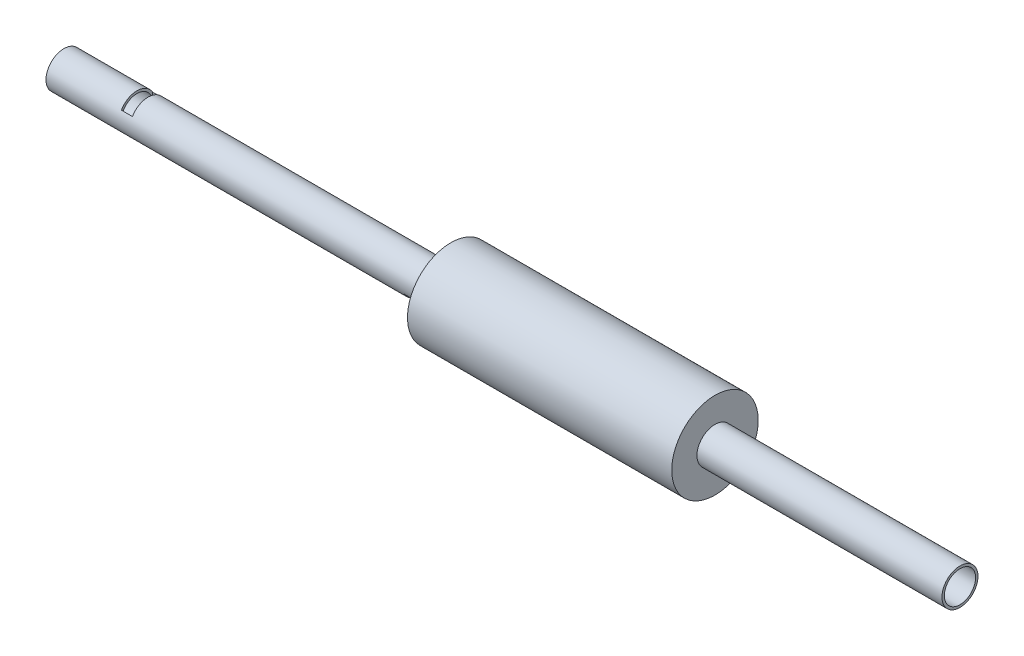
ISO-10303-21;
HEADER;
FILE_DESCRIPTION(('STEP AP214'),'2;1');
FILE_NAME('part.step','',(''),(''),'','','');
FILE_SCHEMA(('AUTOMOTIVE_DESIGN { 1 0 10303 214 1 1 1 1 }'));
ENDSEC;
DATA;
#1=APPLICATION_CONTEXT('core data for automotive mechanical design processes');
#2=APPLICATION_PROTOCOL_DEFINITION('international standard','automotive_design',2000,#1);
#3=PRODUCT_CONTEXT('',#1,'mechanical');
#4=PRODUCT('Part','Part','',(#3));
#5=PRODUCT_RELATED_PRODUCT_CATEGORY('part','',(#4));
#6=PRODUCT_DEFINITION_FORMATION('','',#4);
#7=PRODUCT_DEFINITION_CONTEXT('part definition',#1,'design');
#8=PRODUCT_DEFINITION('design','',#6,#7);
#9=PRODUCT_DEFINITION_SHAPE('','',#8);
#10=(LENGTH_UNIT() NAMED_UNIT(*) SI_UNIT(.MILLI.,.METRE.));
#11=(NAMED_UNIT(*) PLANE_ANGLE_UNIT() SI_UNIT($,.RADIAN.));
#12=(NAMED_UNIT(*) SI_UNIT($,.STERADIAN.) SOLID_ANGLE_UNIT());
#13=UNCERTAINTY_MEASURE_WITH_UNIT(LENGTH_MEASURE(1.E-05),#10,'distance_accuracy_value','');
#14=(GEOMETRIC_REPRESENTATION_CONTEXT(3) GLOBAL_UNCERTAINTY_ASSIGNED_CONTEXT((#13)) GLOBAL_UNIT_ASSIGNED_CONTEXT((#10,
#11,#12)) REPRESENTATION_CONTEXT('',''));
#15=CARTESIAN_POINT('',(0.,0.,0.));
#16=DIRECTION('',(0.,0.,1.));
#17=DIRECTION('',(1.,0.,0.));
#18=AXIS2_PLACEMENT_3D('',#15,#16,#17);
#19=CARTESIAN_POINT('',(196.356223273704,0.,0.));
#20=DIRECTION('',(1.,0.,0.));
#21=DIRECTION('',(0.,0.,-1.));
#22=AXIS2_PLACEMENT_3D('',#19,#20,#21);
#23=CYLINDRICAL_SURFACE('',#22,7.5);
#24=DIRECTION('',(1.,0.,0.));
#25=VECTOR('',#24,1.);
#26=CARTESIAN_POINT('',(196.356223273704,-3.74165738677397,6.5));
#27=LINE('',#26,#25);
#28=CARTESIAN_POINT('',(-68.,-3.74165738677397,6.5));
#29=VERTEX_POINT('',#28);
#30=CARTESIAN_POINT('',(-60.,-3.74165738677397,6.5));
#31=VERTEX_POINT('',#30);
#32=EDGE_CURVE('E149',#29,#31,#27,.T.);
#33=ORIENTED_EDGE('',*,*,#32,.T.);
#34=CARTESIAN_POINT('',(-60.,0.,0.));
#35=DIRECTION('',(1.,0.,0.));
#36=DIRECTION('',(0.,0.,-1.));
#37=AXIS2_PLACEMENT_3D('',#34,#35,#36);
#38=CIRCLE('',#37,7.5);
#39=CARTESIAN_POINT('',(-60.,-3.74165738677396,-6.5));
#40=VERTEX_POINT('',#39);
#41=EDGE_CURVE('E162',#31,#40,#38,.T.);
#42=ORIENTED_EDGE('',*,*,#41,.T.);
#43=DIRECTION('',(1.,0.,0.));
#44=VECTOR('',#43,1.);
#45=CARTESIAN_POINT('',(196.356223273704,-3.74165738677396,-6.5));
#46=LINE('',#45,#44);
#47=CARTESIAN_POINT('',(-68.,-3.74165738677396,-6.5));
#48=VERTEX_POINT('',#47);
#49=EDGE_CURVE('E144',#48,#40,#46,.T.);
#50=ORIENTED_EDGE('',*,*,#49,.F.);
#51=CARTESIAN_POINT('',(-68.,0.,0.));
#52=DIRECTION('',(1.,0.,0.));
#53=DIRECTION('',(0.,0.,-1.));
#54=AXIS2_PLACEMENT_3D('',#51,#52,#53);
#55=CIRCLE('',#54,7.5);
#56=EDGE_CURVE('E147',#29,#48,#55,.T.);
#57=ORIENTED_EDGE('',*,*,#56,.F.);
#58=EDGE_LOOP('',(#33,#42,#50,#57));
#59=FACE_BOUND('',#58,.T.);
#60=CARTESIAN_POINT('',(-216.,0.,0.));
#61=DIRECTION('',(1.,0.,0.));
#62=DIRECTION('',(0.,0.,-1.));
#63=AXIS2_PLACEMENT_3D('',#60,#61,#62);
#64=CIRCLE('',#63,7.49999999999997);
#65=CARTESIAN_POINT('',(-216.,0.,-7.49999999999997));
#66=VERTEX_POINT('',#65);
#67=EDGE_CURVE('E184',#66,#66,#64,.T.);
#68=ORIENTED_EDGE('',*,*,#67,.T.);
#69=EDGE_LOOP('',(#68));
#70=FACE_BOUND('',#69,.T.);
#71=CARTESIAN_POINT('',(-55.,0.,0.));
#72=DIRECTION('',(1.,0.,0.));
#73=DIRECTION('',(0.,0.,-1.));
#74=AXIS2_PLACEMENT_3D('',#71,#72,#73);
#75=CIRCLE('',#74,7.49999999999998);
#76=CARTESIAN_POINT('',(-55.,0.,-7.49999999999998));
#77=VERTEX_POINT('',#76);
#78=EDGE_CURVE('E187',#77,#77,#75,.T.);
#79=ORIENTED_EDGE('',*,*,#78,.F.);
#80=EDGE_LOOP('',(#79));
#81=FACE_BOUND('',#80,.T.);
#82=CARTESIAN_POINT('',(-181.,0.,0.));
#83=DIRECTION('',(-1.,0.,0.));
#84=DIRECTION('',(0.,0.,1.));
#85=AXIS2_PLACEMENT_3D('',#82,#83,#84);
#86=CIRCLE('',#85,7.5);
#87=CARTESIAN_POINT('',(-181.,3.74165738677391,6.50000000000002));
#88=VERTEX_POINT('',#87);
#89=CARTESIAN_POINT('',(-181.,3.74165738677396,-6.49999999999998));
#90=VERTEX_POINT('',#89);
#91=EDGE_CURVE('E110',#88,#90,#86,.T.);
#92=ORIENTED_EDGE('',*,*,#91,.F.);
#93=DIRECTION('',(1.,0.,0.));
#94=VECTOR('',#93,1.);
#95=CARTESIAN_POINT('',(196.356223273704,3.74165738677391,6.50000000000002));
#96=LINE('',#95,#94);
#97=CARTESIAN_POINT('',(-185.6,3.74165738677391,6.50000000000002));
#98=VERTEX_POINT('',#97);
#99=EDGE_CURVE('E130',#98,#88,#96,.T.);
#100=ORIENTED_EDGE('',*,*,#99,.F.);
#101=CARTESIAN_POINT('',(-185.6,0.,0.));
#102=DIRECTION('',(-1.,0.,0.));
#103=DIRECTION('',(0.,0.,1.));
#104=AXIS2_PLACEMENT_3D('',#101,#102,#103);
#105=CIRCLE('',#104,7.5);
#106=CARTESIAN_POINT('',(-185.6,3.74165738677396,-6.49999999999998));
#107=VERTEX_POINT('',#106);
#108=EDGE_CURVE('E136',#98,#107,#105,.T.);
#109=ORIENTED_EDGE('',*,*,#108,.T.);
#110=DIRECTION('',(1.,0.,0.));
#111=VECTOR('',#110,1.);
#112=CARTESIAN_POINT('',(196.356223273704,3.74165738677396,-6.49999999999998));
#113=LINE('',#112,#111);
#114=EDGE_CURVE('E123',#107,#90,#113,.T.);
#115=ORIENTED_EDGE('',*,*,#114,.T.);
#116=EDGE_LOOP('',(#92,#100,#109,#115));
#117=FACE_BOUND('',#116,.T.);
#118=ADVANCED_FACE('F37',(#59,#70,#81,#117),#23,.T.);
#119=CARTESIAN_POINT('',(196.356223273704,0.,0.));
#120=DIRECTION('',(1.,0.,0.));
#121=DIRECTION('',(0.,0.,-1.));
#122=AXIS2_PLACEMENT_3D('',#119,#120,#121);
#123=CYLINDRICAL_SURFACE('',#122,6.49999999999997);
#124=DIRECTION('',(1.,0.,0.));
#125=VECTOR('',#124,1.);
#126=CARTESIAN_POINT('',(0.,0.,6.5));
#127=LINE('',#126,#125);
#128=CARTESIAN_POINT('',(-68.,0.,6.49999999999998));
#129=VERTEX_POINT('',#128);
#130=CARTESIAN_POINT('',(-60.,0.,6.5));
#131=VERTEX_POINT('',#130);
#132=EDGE_CURVE('E152',#129,#131,#127,.T.);
#133=ORIENTED_EDGE('',*,*,#132,.F.);
#134=CARTESIAN_POINT('',(-68.,0.,0.));
#135=DIRECTION('',(1.,0.,0.));
#136=DIRECTION('',(0.,0.,-1.));
#137=AXIS2_PLACEMENT_3D('',#134,#135,#136);
#138=CIRCLE('',#137,6.49999999999997);
#139=CARTESIAN_POINT('',(-68.,0.,-6.49999999999997));
#140=VERTEX_POINT('',#139);
#141=EDGE_CURVE('E142',#140,#129,#138,.F.);
#142=ORIENTED_EDGE('',*,*,#141,.F.);
#143=DIRECTION('',(1.,0.,0.));
#144=VECTOR('',#143,1.);
#145=CARTESIAN_POINT('',(0.,0.,-6.5));
#146=LINE('',#145,#144);
#147=CARTESIAN_POINT('',(-60.,0.,-6.5));
#148=VERTEX_POINT('',#147);
#149=EDGE_CURVE('E155',#140,#148,#146,.T.);
#150=ORIENTED_EDGE('',*,*,#149,.T.);
#151=CARTESIAN_POINT('',(-60.,0.,0.));
#152=DIRECTION('',(1.,0.,0.));
#153=DIRECTION('',(0.,0.,-1.));
#154=AXIS2_PLACEMENT_3D('',#151,#152,#153);
#155=CIRCLE('',#154,6.49999999999997);
#156=EDGE_CURVE('E139',#148,#131,#155,.F.);
#157=ORIENTED_EDGE('',*,*,#156,.T.);
#158=EDGE_LOOP('',(#133,#142,#150,#157));
#159=FACE_BOUND('',#158,.T.);
#160=CARTESIAN_POINT('',(157.,0.,0.));
#161=DIRECTION('',(1.,0.,0.));
#162=DIRECTION('',(0.,0.,-1.));
#163=AXIS2_PLACEMENT_3D('',#160,#161,#162);
#164=CIRCLE('',#163,6.49999999999997);
#165=CARTESIAN_POINT('',(157.,0.,-6.49999999999997));
#166=VERTEX_POINT('',#165);
#167=EDGE_CURVE('E178',#166,#166,#164,.T.);
#168=ORIENTED_EDGE('',*,*,#167,.T.);
#169=EDGE_LOOP('',(#168));
#170=FACE_BOUND('',#169,.T.);
#171=CARTESIAN_POINT('',(-216.,0.,0.));
#172=DIRECTION('',(1.,0.,0.));
#173=DIRECTION('',(0.,0.,-1.));
#174=AXIS2_PLACEMENT_3D('',#171,#172,#173);
#175=CIRCLE('',#174,6.49999999999997);
#176=CARTESIAN_POINT('',(-216.,0.,-6.49999999999997));
#177=VERTEX_POINT('',#176);
#178=EDGE_CURVE('E181',#177,#177,#175,.T.);
#179=ORIENTED_EDGE('',*,*,#178,.F.);
#180=EDGE_LOOP('',(#179));
#181=FACE_BOUND('',#180,.T.);
#182=CARTESIAN_POINT('',(-185.6,0.,0.));
#183=DIRECTION('',(-1.,0.,0.));
#184=DIRECTION('',(0.,0.,1.));
#185=AXIS2_PLACEMENT_3D('',#182,#183,#184);
#186=CIRCLE('',#185,6.49999999999997);
#187=CARTESIAN_POINT('',(-185.6,0.,-6.49999999999998));
#188=VERTEX_POINT('',#187);
#189=CARTESIAN_POINT('',(-185.6,0.,6.50000000000002));
#190=VERTEX_POINT('',#189);
#191=EDGE_CURVE('E124',#188,#190,#186,.F.);
#192=ORIENTED_EDGE('',*,*,#191,.T.);
#193=DIRECTION('',(1.,0.,0.));
#194=VECTOR('',#193,1.);
#195=CARTESIAN_POINT('',(0.,0.,6.50000000000002));
#196=LINE('',#195,#194);
#197=CARTESIAN_POINT('',(-181.,0.,6.50000000000002));
#198=VERTEX_POINT('',#197);
#199=EDGE_CURVE('E60',#190,#198,#196,.T.);
#200=ORIENTED_EDGE('',*,*,#199,.T.);
#201=CARTESIAN_POINT('',(-181.,0.,0.));
#202=DIRECTION('',(-1.,0.,0.));
#203=DIRECTION('',(0.,0.,1.));
#204=AXIS2_PLACEMENT_3D('',#201,#202,#203);
#205=CIRCLE('',#204,6.49999999999997);
#206=CARTESIAN_POINT('',(-181.,0.,-6.49999999999997));
#207=VERTEX_POINT('',#206);
#208=EDGE_CURVE('E108',#207,#198,#205,.F.);
#209=ORIENTED_EDGE('',*,*,#208,.F.);
#210=DIRECTION('',(1.,0.,0.));
#211=VECTOR('',#210,1.);
#212=CARTESIAN_POINT('',(0.,0.,-6.49999999999998));
#213=LINE('',#212,#211);
#214=EDGE_CURVE('E116',#188,#207,#213,.T.);
#215=ORIENTED_EDGE('',*,*,#214,.F.);
#216=EDGE_LOOP('',(#192,#200,#209,#215));
#217=FACE_BOUND('',#216,.T.);
#218=ADVANCED_FACE('F122',(#159,#170,#181,#217),#123,.F.);
#219=CARTESIAN_POINT('',(55.,0.,0.));
#220=DIRECTION('',(-1.,0.,0.));
#221=DIRECTION('',(0.,0.,1.));
#222=AXIS2_PLACEMENT_3D('',#219,#220,#221);
#223=PLANE('',#222);
#224=CARTESIAN_POINT('',(55.,0.,0.));
#225=DIRECTION('',(1.,0.,0.));
#226=DIRECTION('',(0.,0.,-1.));
#227=AXIS2_PLACEMENT_3D('',#224,#225,#226);
#228=CIRCLE('',#227,7.5);
#229=CARTESIAN_POINT('',(55.,0.,-7.5));
#230=VERTEX_POINT('',#229);
#231=EDGE_CURVE('E172',#230,#230,#228,.T.);
#232=ORIENTED_EDGE('',*,*,#231,.F.);
#233=EDGE_LOOP('',(#232));
#234=FACE_BOUND('',#233,.T.);
#235=CARTESIAN_POINT('',(55.,0.,0.));
#236=DIRECTION('',(1.,0.,0.));
#237=DIRECTION('',(0.,0.,-1.));
#238=AXIS2_PLACEMENT_3D('',#235,#236,#237);
#239=CIRCLE('',#238,18.);
#240=CARTESIAN_POINT('',(55.,0.,-18.));
#241=VERTEX_POINT('',#240);
#242=EDGE_CURVE('E11',#241,#241,#239,.T.);
#243=ORIENTED_EDGE('',*,*,#242,.T.);
#244=EDGE_LOOP('',(#243));
#245=FACE_BOUND('',#244,.T.);
#246=ADVANCED_FACE('F39',(#234,#245),#223,.F.);
#247=CARTESIAN_POINT('',(196.356223273704,0.,0.));
#248=DIRECTION('',(1.,0.,0.));
#249=DIRECTION('',(0.,0.,-1.));
#250=AXIS2_PLACEMENT_3D('',#247,#248,#249);
#251=CYLINDRICAL_SURFACE('',#250,18.);
#252=ORIENTED_EDGE('',*,*,#242,.F.);
#253=EDGE_LOOP('',(#252));
#254=FACE_BOUND('',#253,.T.);
#255=CARTESIAN_POINT('',(-55.,0.,0.));
#256=DIRECTION('',(1.,0.,0.));
#257=DIRECTION('',(0.,0.,-1.));
#258=AXIS2_PLACEMENT_3D('',#255,#256,#257);
#259=CIRCLE('',#258,18.);
#260=CARTESIAN_POINT('',(-55.,0.,-18.));
#261=VERTEX_POINT('',#260);
#262=EDGE_CURVE('E45',#261,#261,#259,.T.);
#263=ORIENTED_EDGE('',*,*,#262,.T.);
#264=EDGE_LOOP('',(#263));
#265=FACE_BOUND('',#264,.T.);
#266=ADVANCED_FACE('F192',(#254,#265),#251,.T.);
#267=CARTESIAN_POINT('',(-55.,0.,0.));
#268=DIRECTION('',(-1.,0.,0.));
#269=DIRECTION('',(0.,0.,1.));
#270=AXIS2_PLACEMENT_3D('',#267,#268,#269);
#271=PLANE('',#270);
#272=ORIENTED_EDGE('',*,*,#78,.T.);
#273=EDGE_LOOP('',(#272));
#274=FACE_BOUND('',#273,.T.);
#275=ORIENTED_EDGE('',*,*,#262,.F.);
#276=EDGE_LOOP('',(#275));
#277=FACE_BOUND('',#276,.T.);
#278=ADVANCED_FACE('F194',(#274,#277),#271,.T.);
#279=CARTESIAN_POINT('',(-216.,0.,0.));
#280=DIRECTION('',(-1.,0.,0.));
#281=DIRECTION('',(0.,0.,1.));
#282=AXIS2_PLACEMENT_3D('',#279,#280,#281);
#283=PLANE('',#282);
#284=ORIENTED_EDGE('',*,*,#178,.T.);
#285=EDGE_LOOP('',(#284));
#286=FACE_BOUND('',#285,.T.);
#287=ORIENTED_EDGE('',*,*,#67,.F.);
#288=EDGE_LOOP('',(#287));
#289=FACE_BOUND('',#288,.T.);
#290=ADVANCED_FACE('F196',(#286,#289),#283,.T.);
#291=CARTESIAN_POINT('',(157.,0.,0.));
#292=DIRECTION('',(-1.,0.,0.));
#293=DIRECTION('',(0.,0.,1.));
#294=AXIS2_PLACEMENT_3D('',#291,#292,#293);
#295=PLANE('',#294);
#296=ORIENTED_EDGE('',*,*,#167,.F.);
#297=EDGE_LOOP('',(#296));
#298=FACE_BOUND('',#297,.T.);
#299=CARTESIAN_POINT('',(157.,0.,0.));
#300=DIRECTION('',(1.,0.,0.));
#301=DIRECTION('',(0.,0.,-1.));
#302=AXIS2_PLACEMENT_3D('',#299,#300,#301);
#303=CIRCLE('',#302,7.50000000000001);
#304=CARTESIAN_POINT('',(157.,0.,-7.50000000000001));
#305=VERTEX_POINT('',#304);
#306=EDGE_CURVE('E175',#305,#305,#303,.T.);
#307=ORIENTED_EDGE('',*,*,#306,.T.);
#308=EDGE_LOOP('',(#307));
#309=FACE_BOUND('',#308,.T.);
#310=ADVANCED_FACE('F203',(#298,#309),#295,.F.);
#311=ORIENTED_EDGE('',*,*,#231,.T.);
#312=EDGE_LOOP('',(#311));
#313=FACE_BOUND('',#312,.T.);
#314=ORIENTED_EDGE('',*,*,#306,.F.);
#315=EDGE_LOOP('',(#314));
#316=FACE_BOUND('',#315,.T.);
#317=ADVANCED_FACE('F210',(#313,#316),#23,.T.);
#318=CARTESIAN_POINT('',(0.,-18.001,6.5));
#319=DIRECTION('',(0.,0.,1.));
#320=DIRECTION('',(1.,0.,0.));
#321=AXIS2_PLACEMENT_3D('',#318,#319,#320);
#322=PLANE('',#321);
#323=DIRECTION('',(0.,1.,0.));
#324=VECTOR('',#323,1.);
#325=CARTESIAN_POINT('',(-68.,-18.001,6.5));
#326=LINE('',#325,#324);
#327=EDGE_CURVE('E159',#29,#129,#326,.T.);
#328=ORIENTED_EDGE('',*,*,#327,.T.);
#329=ORIENTED_EDGE('',*,*,#132,.T.);
#330=DIRECTION('',(0.,1.,0.));
#331=VECTOR('',#330,1.);
#332=CARTESIAN_POINT('',(-60.,-18.001,6.5));
#333=LINE('',#332,#331);
#334=EDGE_CURVE('E158',#31,#131,#333,.T.);
#335=ORIENTED_EDGE('',*,*,#334,.F.);
#336=ORIENTED_EDGE('',*,*,#32,.F.);
#337=EDGE_LOOP('',(#328,#329,#335,#336));
#338=FACE_BOUND('',#337,.T.);
#339=ADVANCED_FACE('F220',(#338),#322,.F.);
#340=CARTESIAN_POINT('',(-68.,-18.001,0.));
#341=DIRECTION('',(1.,0.,0.));
#342=DIRECTION('',(0.,0.,-1.));
#343=AXIS2_PLACEMENT_3D('',#340,#341,#342);
#344=PLANE('',#343);
#345=ORIENTED_EDGE('',*,*,#56,.T.);
#346=DIRECTION('',(0.,1.,0.));
#347=VECTOR('',#346,1.);
#348=CARTESIAN_POINT('',(-68.,-18.001,-6.5));
#349=LINE('',#348,#347);
#350=EDGE_CURVE('E163',#48,#140,#349,.T.);
#351=ORIENTED_EDGE('',*,*,#350,.T.);
#352=ORIENTED_EDGE('',*,*,#141,.T.);
#353=ORIENTED_EDGE('',*,*,#327,.F.);
#354=EDGE_LOOP('',(#345,#351,#352,#353));
#355=FACE_BOUND('',#354,.T.);
#356=ADVANCED_FACE('F226',(#355),#344,.T.);
#357=CARTESIAN_POINT('',(0.,-18.001,-6.5));
#358=DIRECTION('',(0.,0.,1.));
#359=DIRECTION('',(1.,0.,0.));
#360=AXIS2_PLACEMENT_3D('',#357,#358,#359);
#361=PLANE('',#360);
#362=ORIENTED_EDGE('',*,*,#49,.T.);
#363=DIRECTION('',(0.,1.,0.));
#364=VECTOR('',#363,1.);
#365=CARTESIAN_POINT('',(-60.,-18.001,-6.5));
#366=LINE('',#365,#364);
#367=EDGE_CURVE('E166',#40,#148,#366,.T.);
#368=ORIENTED_EDGE('',*,*,#367,.T.);
#369=ORIENTED_EDGE('',*,*,#149,.F.);
#370=ORIENTED_EDGE('',*,*,#350,.F.);
#371=EDGE_LOOP('',(#362,#368,#369,#370));
#372=FACE_BOUND('',#371,.T.);
#373=ADVANCED_FACE('F280',(#372),#361,.T.);
#374=CARTESIAN_POINT('',(-60.,-18.001,0.));
#375=DIRECTION('',(1.,0.,0.));
#376=DIRECTION('',(0.,0.,-1.));
#377=AXIS2_PLACEMENT_3D('',#374,#375,#376);
#378=PLANE('',#377);
#379=ORIENTED_EDGE('',*,*,#334,.T.);
#380=ORIENTED_EDGE('',*,*,#156,.F.);
#381=ORIENTED_EDGE('',*,*,#367,.F.);
#382=ORIENTED_EDGE('',*,*,#41,.F.);
#383=EDGE_LOOP('',(#379,#380,#381,#382));
#384=FACE_BOUND('',#383,.T.);
#385=ADVANCED_FACE('F290',(#384),#378,.F.);
#386=CARTESIAN_POINT('',(0.,18.001,6.50000000000002));
#387=DIRECTION('',(0.,0.,-1.));
#388=DIRECTION('',(-1.,0.,0.));
#389=AXIS2_PLACEMENT_3D('',#386,#387,#388);
#390=PLANE('',#389);
#391=ORIENTED_EDGE('',*,*,#99,.T.);
#392=DIRECTION('',(0.,-1.,0.));
#393=VECTOR('',#392,1.);
#394=CARTESIAN_POINT('',(-181.,18.001,6.50000000000002));
#395=LINE('',#394,#393);
#396=EDGE_CURVE('E113',#88,#198,#395,.T.);
#397=ORIENTED_EDGE('',*,*,#396,.T.);
#398=ORIENTED_EDGE('',*,*,#199,.F.);
#399=DIRECTION('',(0.,-1.,0.));
#400=VECTOR('',#399,1.);
#401=CARTESIAN_POINT('',(-185.6,18.001,6.50000000000002));
#402=LINE('',#401,#400);
#403=EDGE_CURVE('E120',#98,#190,#402,.T.);
#404=ORIENTED_EDGE('',*,*,#403,.F.);
#405=EDGE_LOOP('',(#391,#397,#398,#404));
#406=FACE_BOUND('',#405,.T.);
#407=ADVANCED_FACE('F299',(#406),#390,.T.);
#408=CARTESIAN_POINT('',(-181.,18.001,0.));
#409=DIRECTION('',(-1.,0.,0.));
#410=DIRECTION('',(0.,0.,1.));
#411=AXIS2_PLACEMENT_3D('',#408,#409,#410);
#412=PLANE('',#411);
#413=ORIENTED_EDGE('',*,*,#91,.T.);
#414=DIRECTION('',(0.,-1.,0.));
#415=VECTOR('',#414,1.);
#416=CARTESIAN_POINT('',(-181.,18.001,-6.49999999999998));
#417=LINE('',#416,#415);
#418=EDGE_CURVE('E103',#90,#207,#417,.T.);
#419=ORIENTED_EDGE('',*,*,#418,.T.);
#420=ORIENTED_EDGE('',*,*,#208,.T.);
#421=ORIENTED_EDGE('',*,*,#396,.F.);
#422=EDGE_LOOP('',(#413,#419,#420,#421));
#423=FACE_BOUND('',#422,.T.);
#424=ADVANCED_FACE('F105',(#423),#412,.T.);
#425=CARTESIAN_POINT('',(0.,18.001,-6.49999999999998));
#426=DIRECTION('',(0.,0.,-1.));
#427=DIRECTION('',(-1.,0.,0.));
#428=AXIS2_PLACEMENT_3D('',#425,#426,#427);
#429=PLANE('',#428);
#430=DIRECTION('',(0.,-1.,0.));
#431=VECTOR('',#430,1.);
#432=CARTESIAN_POINT('',(-185.6,18.001,-6.49999999999998));
#433=LINE('',#432,#431);
#434=EDGE_CURVE('E52',#107,#188,#433,.T.);
#435=ORIENTED_EDGE('',*,*,#434,.T.);
#436=ORIENTED_EDGE('',*,*,#214,.T.);
#437=ORIENTED_EDGE('',*,*,#418,.F.);
#438=ORIENTED_EDGE('',*,*,#114,.F.);
#439=EDGE_LOOP('',(#435,#436,#437,#438));
#440=FACE_BOUND('',#439,.T.);
#441=ADVANCED_FACE('F117',(#440),#429,.F.);
#442=CARTESIAN_POINT('',(-185.6,18.001,0.));
#443=DIRECTION('',(-1.,0.,0.));
#444=DIRECTION('',(0.,0.,1.));
#445=AXIS2_PLACEMENT_3D('',#442,#443,#444);
#446=PLANE('',#445);
#447=ORIENTED_EDGE('',*,*,#403,.T.);
#448=ORIENTED_EDGE('',*,*,#191,.F.);
#449=ORIENTED_EDGE('',*,*,#434,.F.);
#450=ORIENTED_EDGE('',*,*,#108,.F.);
#451=EDGE_LOOP('',(#447,#448,#449,#450));
#452=FACE_BOUND('',#451,.T.);
#453=ADVANCED_FACE('F335',(#452),#446,.F.);
#454=CLOSED_SHELL('',(#118,#218,#246,#266,#278,#290,#310,#317,#339,#356,#373,#385,#407,#424,
#441,#453));
#455=MANIFOLD_SOLID_BREP('B2',#454);
#456=ADVANCED_BREP_SHAPE_REPRESENTATION('',(#18,#455),#14);
#457=SHAPE_DEFINITION_REPRESENTATION(#9,#456);
ENDSEC;
END-ISO-10303-21;
